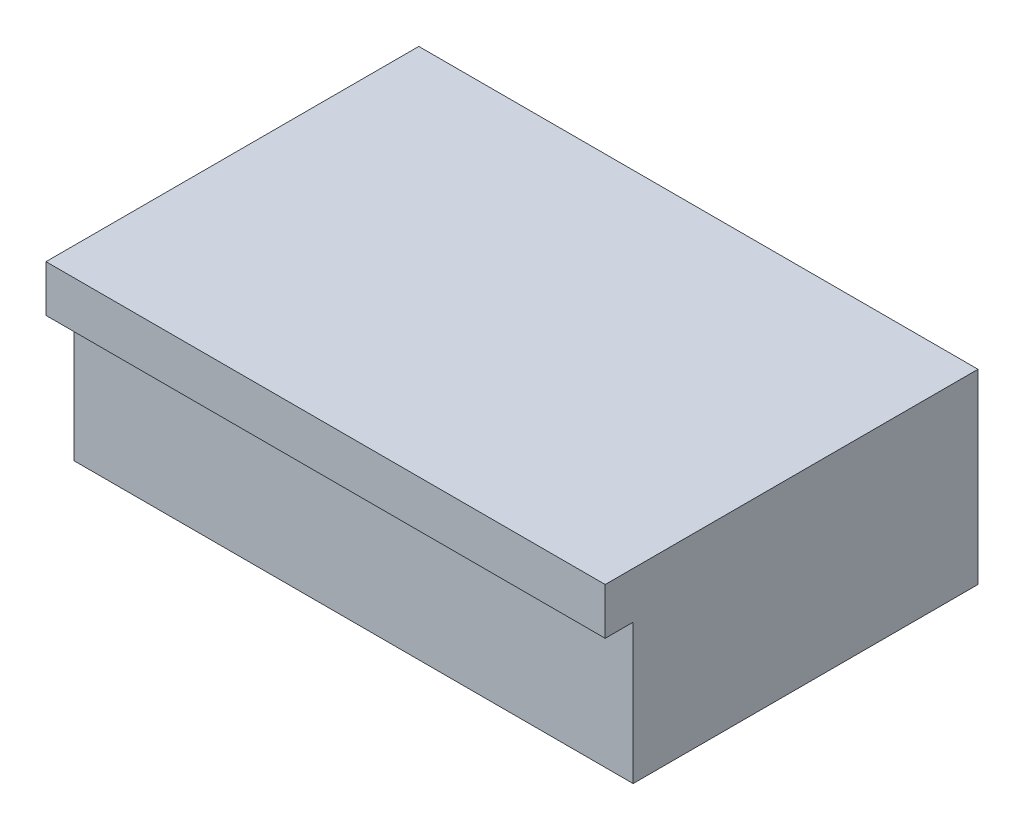
ISO-10303-21;
HEADER;
FILE_DESCRIPTION(('STEP AP214'),'2;1');
FILE_NAME('part.step','',(''),(''),'','','');
FILE_SCHEMA(('AUTOMOTIVE_DESIGN { 1 0 10303 214 1 1 1 1 }'));
ENDSEC;
DATA;
#1=APPLICATION_CONTEXT('core data for automotive mechanical design processes');
#2=APPLICATION_PROTOCOL_DEFINITION('international standard','automotive_design',2000,#1);
#3=PRODUCT_CONTEXT('',#1,'mechanical');
#4=PRODUCT('Part','Part','',(#3));
#5=PRODUCT_RELATED_PRODUCT_CATEGORY('part','',(#4));
#6=PRODUCT_DEFINITION_FORMATION('','',#4);
#7=PRODUCT_DEFINITION_CONTEXT('part definition',#1,'design');
#8=PRODUCT_DEFINITION('design','',#6,#7);
#9=PRODUCT_DEFINITION_SHAPE('','',#8);
#10=(LENGTH_UNIT() NAMED_UNIT(*) SI_UNIT(.MILLI.,.METRE.));
#11=(NAMED_UNIT(*) PLANE_ANGLE_UNIT() SI_UNIT($,.RADIAN.));
#12=(NAMED_UNIT(*) SI_UNIT($,.STERADIAN.) SOLID_ANGLE_UNIT());
#13=UNCERTAINTY_MEASURE_WITH_UNIT(LENGTH_MEASURE(1.E-05),#10,'distance_accuracy_value','');
#14=(GEOMETRIC_REPRESENTATION_CONTEXT(3) GLOBAL_UNCERTAINTY_ASSIGNED_CONTEXT((#13)) GLOBAL_UNIT_ASSIGNED_CONTEXT((#10,
#11,#12)) REPRESENTATION_CONTEXT('',''));
#15=CARTESIAN_POINT('',(0.,0.,0.));
#16=DIRECTION('',(0.,0.,1.));
#17=DIRECTION('',(1.,0.,0.));
#18=AXIS2_PLACEMENT_3D('',#15,#16,#17);
#19=CARTESIAN_POINT('',(0.,0.,0.));
#20=DIRECTION('',(0.,-1.,0.));
#21=DIRECTION('',(0.,0.,-1.));
#22=AXIS2_PLACEMENT_3D('',#19,#20,#21);
#23=PLANE('',#22);
#24=DIRECTION('',(0.,0.,-1.));
#25=VECTOR('',#24,1.);
#26=CARTESIAN_POINT('',(30.,0.,0.));
#27=LINE('',#26,#25);
#28=CARTESIAN_POINT('',(30.,0.,-1.5));
#29=VERTEX_POINT('',#28);
#30=CARTESIAN_POINT('',(30.,0.,-20.));
#31=VERTEX_POINT('',#30);
#32=EDGE_CURVE('E116',#29,#31,#27,.T.);
#33=ORIENTED_EDGE('',*,*,#32,.F.);
#34=DIRECTION('',(1.,0.,0.));
#35=VECTOR('',#34,1.);
#36=CARTESIAN_POINT('',(0.,0.,-1.5));
#37=LINE('',#36,#35);
#38=CARTESIAN_POINT('',(0.,0.,-1.5));
#39=VERTEX_POINT('',#38);
#40=EDGE_CURVE('E101',#39,#29,#37,.T.);
#41=ORIENTED_EDGE('',*,*,#40,.F.);
#42=DIRECTION('',(0.,0.,1.));
#43=VECTOR('',#42,1.);
#44=CARTESIAN_POINT('',(0.,0.,0.));
#45=LINE('',#44,#43);
#46=CARTESIAN_POINT('',(0.,0.,-20.));
#47=VERTEX_POINT('',#46);
#48=EDGE_CURVE('E120',#47,#39,#45,.T.);
#49=ORIENTED_EDGE('',*,*,#48,.F.);
#50=DIRECTION('',(-1.,0.,0.));
#51=VECTOR('',#50,1.);
#52=CARTESIAN_POINT('',(0.,0.,-20.));
#53=LINE('',#52,#51);
#54=EDGE_CURVE('E80',#31,#47,#53,.T.);
#55=ORIENTED_EDGE('',*,*,#54,.F.);
#56=EDGE_LOOP('',(#33,#41,#49,#55));
#57=FACE_BOUND('',#56,.T.);
#58=ADVANCED_FACE('F41',(#57),#23,.T.);
#59=CARTESIAN_POINT('',(0.,10.,0.));
#60=DIRECTION('',(1.,0.,0.));
#61=DIRECTION('',(0.,0.,-1.));
#62=AXIS2_PLACEMENT_3D('',#59,#60,#61);
#63=PLANE('',#62);
#64=DIRECTION('',(0.,-1.,0.));
#65=VECTOR('',#64,1.);
#66=CARTESIAN_POINT('',(0.,7.5,-1.5));
#67=LINE('',#66,#65);
#68=CARTESIAN_POINT('',(0.,7.5,-1.5));
#69=VERTEX_POINT('',#68);
#70=EDGE_CURVE('E56',#69,#39,#67,.T.);
#71=ORIENTED_EDGE('',*,*,#70,.F.);
#72=DIRECTION('',(0.,0.,1.));
#73=VECTOR('',#72,1.);
#74=CARTESIAN_POINT('',(0.,7.5,-1.5));
#75=LINE('',#74,#73);
#76=CARTESIAN_POINT('',(0.,7.5,0.));
#77=VERTEX_POINT('',#76);
#78=EDGE_CURVE('E124',#69,#77,#75,.T.);
#79=ORIENTED_EDGE('',*,*,#78,.T.);
#80=DIRECTION('',(0.,-1.,0.));
#81=VECTOR('',#80,1.);
#82=CARTESIAN_POINT('',(0.,10.,0.));
#83=LINE('',#82,#81);
#84=CARTESIAN_POINT('',(0.,10.,0.));
#85=VERTEX_POINT('',#84);
#86=EDGE_CURVE('E11',#85,#77,#83,.T.);
#87=ORIENTED_EDGE('',*,*,#86,.F.);
#88=DIRECTION('',(0.,0.,1.));
#89=VECTOR('',#88,1.);
#90=CARTESIAN_POINT('',(0.,10.,0.));
#91=LINE('',#90,#89);
#92=CARTESIAN_POINT('',(0.,10.,-20.));
#93=VERTEX_POINT('',#92);
#94=EDGE_CURVE('E122',#93,#85,#91,.T.);
#95=ORIENTED_EDGE('',*,*,#94,.F.);
#96=DIRECTION('',(0.,-1.,0.));
#97=VECTOR('',#96,1.);
#98=CARTESIAN_POINT('',(0.,10.,-20.));
#99=LINE('',#98,#97);
#100=EDGE_CURVE('E128',#93,#47,#99,.T.);
#101=ORIENTED_EDGE('',*,*,#100,.T.);
#102=ORIENTED_EDGE('',*,*,#48,.T.);
#103=EDGE_LOOP('',(#71,#79,#87,#95,#101,#102));
#104=FACE_BOUND('',#103,.T.);
#105=ADVANCED_FACE('F43',(#104),#63,.F.);
#106=CARTESIAN_POINT('',(0.,10.,0.));
#107=DIRECTION('',(0.,0.,-1.));
#108=DIRECTION('',(-1.,0.,0.));
#109=AXIS2_PLACEMENT_3D('',#106,#107,#108);
#110=PLANE('',#109);
#111=ORIENTED_EDGE('',*,*,#86,.T.);
#112=DIRECTION('',(-1.,0.,0.));
#113=VECTOR('',#112,1.);
#114=CARTESIAN_POINT('',(0.,7.5,0.));
#115=LINE('',#114,#113);
#116=CARTESIAN_POINT('',(30.,7.5,0.));
#117=VERTEX_POINT('',#116);
#118=EDGE_CURVE('E135',#117,#77,#115,.T.);
#119=ORIENTED_EDGE('',*,*,#118,.F.);
#120=DIRECTION('',(0.,-1.,0.));
#121=VECTOR('',#120,1.);
#122=CARTESIAN_POINT('',(30.,10.,0.));
#123=LINE('',#122,#121);
#124=CARTESIAN_POINT('',(30.,10.,0.));
#125=VERTEX_POINT('',#124);
#126=EDGE_CURVE('E49',#125,#117,#123,.T.);
#127=ORIENTED_EDGE('',*,*,#126,.F.);
#128=DIRECTION('',(1.,0.,0.));
#129=VECTOR('',#128,1.);
#130=CARTESIAN_POINT('',(0.,10.,0.));
#131=LINE('',#130,#129);
#132=EDGE_CURVE('E87',#85,#125,#131,.T.);
#133=ORIENTED_EDGE('',*,*,#132,.F.);
#134=EDGE_LOOP('',(#111,#119,#127,#133));
#135=FACE_BOUND('',#134,.T.);
#136=ADVANCED_FACE('F134',(#135),#110,.F.);
#137=CARTESIAN_POINT('',(30.,10.,0.));
#138=DIRECTION('',(-1.,0.,0.));
#139=DIRECTION('',(0.,0.,1.));
#140=AXIS2_PLACEMENT_3D('',#137,#138,#139);
#141=PLANE('',#140);
#142=ORIENTED_EDGE('',*,*,#126,.T.);
#143=DIRECTION('',(0.,0.,1.));
#144=VECTOR('',#143,1.);
#145=CARTESIAN_POINT('',(30.,7.5,-1.5));
#146=LINE('',#145,#144);
#147=CARTESIAN_POINT('',(30.,7.5,-1.5));
#148=VERTEX_POINT('',#147);
#149=EDGE_CURVE('E117',#148,#117,#146,.T.);
#150=ORIENTED_EDGE('',*,*,#149,.F.);
#151=DIRECTION('',(0.,1.,0.));
#152=VECTOR('',#151,1.);
#153=CARTESIAN_POINT('',(30.,7.5,-1.5));
#154=LINE('',#153,#152);
#155=EDGE_CURVE('E104',#29,#148,#154,.T.);
#156=ORIENTED_EDGE('',*,*,#155,.F.);
#157=ORIENTED_EDGE('',*,*,#32,.T.);
#158=DIRECTION('',(0.,-1.,0.));
#159=VECTOR('',#158,1.);
#160=CARTESIAN_POINT('',(30.,10.,-20.));
#161=LINE('',#160,#159);
#162=CARTESIAN_POINT('',(30.,10.,-20.));
#163=VERTEX_POINT('',#162);
#164=EDGE_CURVE('E130',#163,#31,#161,.T.);
#165=ORIENTED_EDGE('',*,*,#164,.F.);
#166=DIRECTION('',(0.,0.,-1.));
#167=VECTOR('',#166,1.);
#168=CARTESIAN_POINT('',(30.,10.,0.));
#169=LINE('',#168,#167);
#170=EDGE_CURVE('E132',#125,#163,#169,.T.);
#171=ORIENTED_EDGE('',*,*,#170,.F.);
#172=EDGE_LOOP('',(#142,#150,#156,#157,#165,#171));
#173=FACE_BOUND('',#172,.T.);
#174=ADVANCED_FACE('F114',(#173),#141,.F.);
#175=CARTESIAN_POINT('',(0.,10.,-20.));
#176=DIRECTION('',(0.,0.,1.));
#177=DIRECTION('',(1.,0.,0.));
#178=AXIS2_PLACEMENT_3D('',#175,#176,#177);
#179=PLANE('',#178);
#180=ORIENTED_EDGE('',*,*,#54,.T.);
#181=ORIENTED_EDGE('',*,*,#100,.F.);
#182=DIRECTION('',(-1.,0.,0.));
#183=VECTOR('',#182,1.);
#184=CARTESIAN_POINT('',(0.,10.,-20.));
#185=LINE('',#184,#183);
#186=EDGE_CURVE('E65',#163,#93,#185,.T.);
#187=ORIENTED_EDGE('',*,*,#186,.F.);
#188=ORIENTED_EDGE('',*,*,#164,.T.);
#189=EDGE_LOOP('',(#180,#181,#187,#188));
#190=FACE_BOUND('',#189,.T.);
#191=ADVANCED_FACE('F148',(#190),#179,.F.);
#192=CARTESIAN_POINT('',(0.,10.,0.));
#193=DIRECTION('',(0.,-1.,0.));
#194=DIRECTION('',(0.,0.,-1.));
#195=AXIS2_PLACEMENT_3D('',#192,#193,#194);
#196=PLANE('',#195);
#197=ORIENTED_EDGE('',*,*,#94,.T.);
#198=ORIENTED_EDGE('',*,*,#132,.T.);
#199=ORIENTED_EDGE('',*,*,#170,.T.);
#200=ORIENTED_EDGE('',*,*,#186,.T.);
#201=EDGE_LOOP('',(#197,#198,#199,#200));
#202=FACE_BOUND('',#201,.T.);
#203=ADVANCED_FACE('F147',(#202),#196,.F.);
#204=CARTESIAN_POINT('',(0.,7.5,-1.5));
#205=DIRECTION('',(0.,1.,0.));
#206=DIRECTION('',(0.,0.,1.));
#207=AXIS2_PLACEMENT_3D('',#204,#205,#206);
#208=PLANE('',#207);
#209=ORIENTED_EDGE('',*,*,#118,.T.);
#210=ORIENTED_EDGE('',*,*,#78,.F.);
#211=DIRECTION('',(-1.,0.,0.));
#212=VECTOR('',#211,1.);
#213=CARTESIAN_POINT('',(0.,7.5,-1.5));
#214=LINE('',#213,#212);
#215=EDGE_CURVE('E118',#148,#69,#214,.T.);
#216=ORIENTED_EDGE('',*,*,#215,.F.);
#217=ORIENTED_EDGE('',*,*,#149,.T.);
#218=EDGE_LOOP('',(#209,#210,#216,#217));
#219=FACE_BOUND('',#218,.T.);
#220=ADVANCED_FACE('F151',(#219),#208,.F.);
#221=CARTESIAN_POINT('',(0.,0.,-1.5));
#222=DIRECTION('',(0.,0.,1.));
#223=DIRECTION('',(1.,0.,0.));
#224=AXIS2_PLACEMENT_3D('',#221,#222,#223);
#225=PLANE('',#224);
#226=ORIENTED_EDGE('',*,*,#70,.T.);
#227=ORIENTED_EDGE('',*,*,#40,.T.);
#228=ORIENTED_EDGE('',*,*,#155,.T.);
#229=ORIENTED_EDGE('',*,*,#215,.T.);
#230=EDGE_LOOP('',(#226,#227,#228,#229));
#231=FACE_BOUND('',#230,.T.);
#232=ADVANCED_FACE('F103',(#231),#225,.T.);
#233=CLOSED_SHELL('',(#58,#105,#136,#174,#191,#203,#220,#232));
#234=MANIFOLD_SOLID_BREP('B2',#233);
#235=ADVANCED_BREP_SHAPE_REPRESENTATION('',(#18,#234),#14);
#236=SHAPE_DEFINITION_REPRESENTATION(#9,#235);
ENDSEC;
END-ISO-10303-21;
